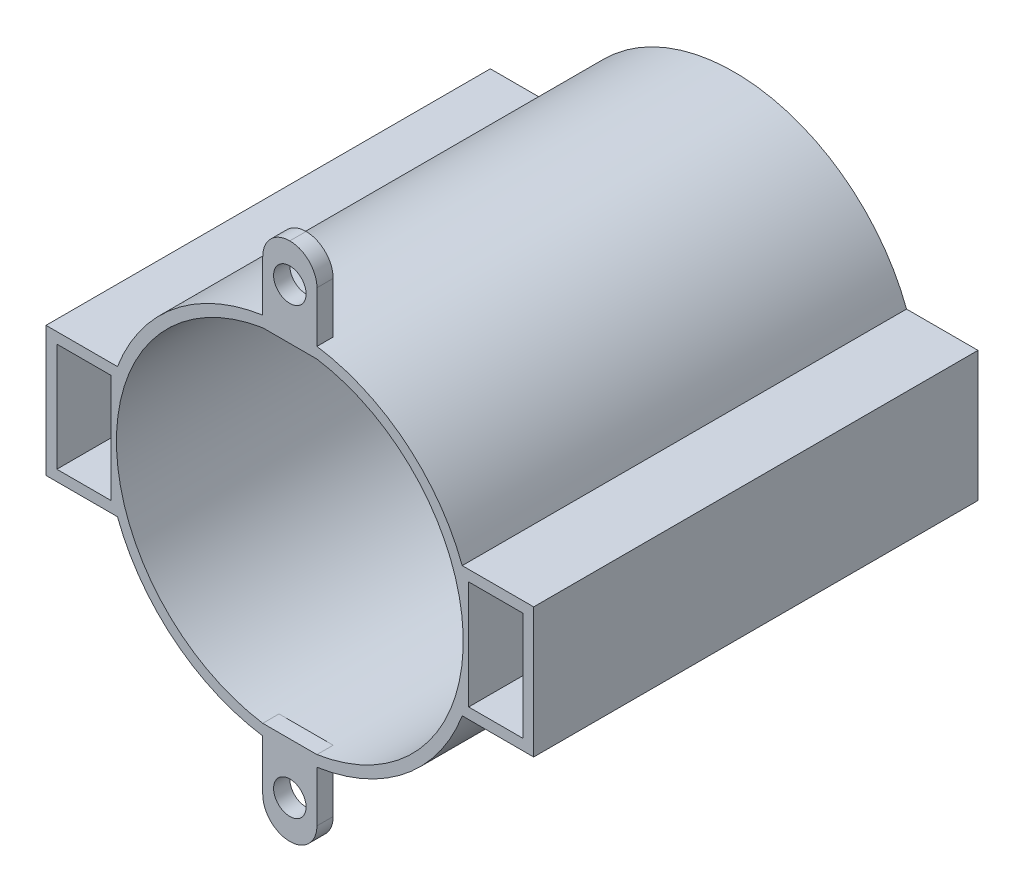
ISO-10303-21;
HEADER;
FILE_DESCRIPTION(('STEP AP214'),'2;1');
FILE_NAME('part.step','',(''),(''),'','','');
FILE_SCHEMA(('AUTOMOTIVE_DESIGN { 1 0 10303 214 1 1 1 1 }'));
ENDSEC;
DATA;
#1=APPLICATION_CONTEXT('core data for automotive mechanical design processes');
#2=APPLICATION_PROTOCOL_DEFINITION('international standard','automotive_design',2000,#1);
#3=PRODUCT_CONTEXT('',#1,'mechanical');
#4=PRODUCT('Part','Part','',(#3));
#5=PRODUCT_RELATED_PRODUCT_CATEGORY('part','',(#4));
#6=PRODUCT_DEFINITION_FORMATION('','',#4);
#7=PRODUCT_DEFINITION_CONTEXT('part definition',#1,'design');
#8=PRODUCT_DEFINITION('design','',#6,#7);
#9=PRODUCT_DEFINITION_SHAPE('','',#8);
#10=(LENGTH_UNIT() NAMED_UNIT(*) SI_UNIT(.MILLI.,.METRE.));
#11=(NAMED_UNIT(*) PLANE_ANGLE_UNIT() SI_UNIT($,.RADIAN.));
#12=(NAMED_UNIT(*) SI_UNIT($,.STERADIAN.) SOLID_ANGLE_UNIT());
#13=UNCERTAINTY_MEASURE_WITH_UNIT(LENGTH_MEASURE(1.E-05),#10,'distance_accuracy_value','');
#14=(GEOMETRIC_REPRESENTATION_CONTEXT(3) GLOBAL_UNCERTAINTY_ASSIGNED_CONTEXT((#13)) GLOBAL_UNIT_ASSIGNED_CONTEXT((#10,
#11,#12)) REPRESENTATION_CONTEXT('',''));
#15=CARTESIAN_POINT('',(0.,0.,0.));
#16=DIRECTION('',(0.,0.,1.));
#17=DIRECTION('',(1.,0.,0.));
#18=AXIS2_PLACEMENT_3D('',#15,#16,#17);
#19=CARTESIAN_POINT('',(0.,0.,-14.));
#20=DIRECTION('',(0.,0.,1.));
#21=DIRECTION('',(1.,0.,0.));
#22=AXIS2_PLACEMENT_3D('',#19,#20,#21);
#23=CYLINDRICAL_SURFACE('',#22,5.15);
#24=CARTESIAN_POINT('',(0.,0.,-14.));
#25=DIRECTION('',(0.,0.,1.));
#26=DIRECTION('',(1.,0.,0.));
#27=AXIS2_PLACEMENT_3D('',#24,#25,#26);
#28=CIRCLE('',#27,5.15);
#29=CARTESIAN_POINT('',(5.15,0.,-14.));
#30=VERTEX_POINT('',#29);
#31=EDGE_CURVE('E1034',#30,#30,#28,.T.);
#32=ORIENTED_EDGE('',*,*,#31,.F.);
#33=EDGE_LOOP('',(#32));
#34=FACE_BOUND('',#33,.T.);
#35=CARTESIAN_POINT('',(0.,0.,-9.));
#36=DIRECTION('',(0.,0.,1.));
#37=DIRECTION('',(1.,0.,0.));
#38=AXIS2_PLACEMENT_3D('',#35,#36,#37);
#39=CIRCLE('',#38,5.15);
#40=CARTESIAN_POINT('',(5.15,0.,-9.));
#41=VERTEX_POINT('',#40);
#42=EDGE_CURVE('E13',#41,#41,#39,.F.);
#43=ORIENTED_EDGE('',*,*,#42,.F.);
#44=EDGE_LOOP('',(#43));
#45=FACE_BOUND('',#44,.T.);
#46=ADVANCED_FACE('F789',(#34,#45),#23,.F.);
#47=CARTESIAN_POINT('',(0.,0.,27.));
#48=DIRECTION('',(0.,0.,-1.));
#49=DIRECTION('',(-1.,0.,0.));
#50=AXIS2_PLACEMENT_3D('',#47,#48,#49);
#51=CYLINDRICAL_SURFACE('',#50,16.);
#52=CARTESIAN_POINT('',(0.,0.,0.));
#53=DIRECTION('',(0.,0.,1.));
#54=DIRECTION('',(1.,0.,0.));
#55=AXIS2_PLACEMENT_3D('',#52,#53,#54);
#56=CIRCLE('',#55,16.);
#57=CARTESIAN_POINT('',(16.,0.,0.));
#58=VERTEX_POINT('',#57);
#59=EDGE_CURVE('E1085',#58,#58,#56,.T.);
#60=ORIENTED_EDGE('',*,*,#59,.F.);
#61=EDGE_LOOP('',(#60));
#62=FACE_BOUND('',#61,.T.);
#63=CARTESIAN_POINT('',(0.,0.,25.5));
#64=DIRECTION('',(0.,0.,1.));
#65=DIRECTION('',(1.,0.,0.));
#66=AXIS2_PLACEMENT_3D('',#63,#64,#65);
#67=CIRCLE('',#66,16.);
#68=CARTESIAN_POINT('',(-2.5,-15.8034806292791,25.5));
#69=VERTEX_POINT('',#68);
#70=CARTESIAN_POINT('',(2.5,-15.8034806292791,25.5));
#71=VERTEX_POINT('',#70);
#72=EDGE_CURVE('E1126',#69,#71,#67,.T.);
#73=ORIENTED_EDGE('',*,*,#72,.T.);
#74=DIRECTION('',(0.,0.,1.));
#75=VECTOR('',#74,1.);
#76=CARTESIAN_POINT('',(2.5,-15.8034806292791,25.5));
#77=LINE('',#76,#75);
#78=CARTESIAN_POINT('',(2.5,-15.8034806292791,27.));
#79=VERTEX_POINT('',#78);
#80=EDGE_CURVE('E1185',#71,#79,#77,.T.);
#81=ORIENTED_EDGE('',*,*,#80,.T.);
#82=CARTESIAN_POINT('',(0.,0.,27.));
#83=DIRECTION('',(0.,0.,1.));
#84=DIRECTION('',(1.,0.,0.));
#85=AXIS2_PLACEMENT_3D('',#82,#83,#84);
#86=CIRCLE('',#85,16.);
#87=CARTESIAN_POINT('',(2.50000000000001,15.8034806292791,27.));
#88=VERTEX_POINT('',#87);
#89=EDGE_CURVE('E1095',#79,#88,#86,.T.);
#90=ORIENTED_EDGE('',*,*,#89,.T.);
#91=DIRECTION('',(0.,0.,1.));
#92=VECTOR('',#91,1.);
#93=CARTESIAN_POINT('',(2.5,15.8034806292791,25.5));
#94=LINE('',#93,#92);
#95=CARTESIAN_POINT('',(2.5,15.8034806292791,25.5));
#96=VERTEX_POINT('',#95);
#97=EDGE_CURVE('E1206',#96,#88,#94,.T.);
#98=ORIENTED_EDGE('',*,*,#97,.F.);
#99=CARTESIAN_POINT('',(0.,0.,25.5));
#100=DIRECTION('',(0.,0.,1.));
#101=DIRECTION('',(1.,0.,0.));
#102=AXIS2_PLACEMENT_3D('',#99,#100,#101);
#103=CIRCLE('',#102,16.);
#104=CARTESIAN_POINT('',(-2.5,15.8034806292791,25.5));
#105=VERTEX_POINT('',#104);
#106=EDGE_CURVE('E1104',#96,#105,#103,.T.);
#107=ORIENTED_EDGE('',*,*,#106,.T.);
#108=DIRECTION('',(0.,0.,1.));
#109=VECTOR('',#108,1.);
#110=CARTESIAN_POINT('',(-2.5,15.8034806292791,25.5));
#111=LINE('',#110,#109);
#112=CARTESIAN_POINT('',(-2.5,15.8034806292791,27.));
#113=VERTEX_POINT('',#112);
#114=EDGE_CURVE('E1214',#105,#113,#111,.T.);
#115=ORIENTED_EDGE('',*,*,#114,.T.);
#116=CARTESIAN_POINT('',(-2.5,-15.8034806292791,27.));
#117=VERTEX_POINT('',#116);
#118=EDGE_CURVE('E1092',#113,#117,#86,.T.);
#119=ORIENTED_EDGE('',*,*,#118,.T.);
#120=DIRECTION('',(0.,0.,1.));
#121=VECTOR('',#120,1.);
#122=CARTESIAN_POINT('',(-2.5,-15.8034806292791,25.5));
#123=LINE('',#122,#121);
#124=EDGE_CURVE('E1177',#69,#117,#123,.T.);
#125=ORIENTED_EDGE('',*,*,#124,.F.);
#126=EDGE_LOOP('',(#73,#81,#90,#98,#107,#115,#119,#125));
#127=FACE_BOUND('',#126,.T.);
#128=ADVANCED_FACE('F1261',(#62,#127),#51,.F.);
#129=CARTESIAN_POINT('',(0.,0.,27.));
#130=DIRECTION('',(0.,0.,-1.));
#131=DIRECTION('',(-1.,0.,0.));
#132=AXIS2_PLACEMENT_3D('',#129,#130,#131);
#133=CYLINDRICAL_SURFACE('',#132,17.);
#134=DIRECTION('',(0.,0.,-1.));
#135=VECTOR('',#134,1.);
#136=CARTESIAN_POINT('',(2.5,-16.8151717208002,27.));
#137=LINE('',#136,#135);
#138=CARTESIAN_POINT('',(2.5,-16.8151717208002,25.5));
#139=VERTEX_POINT('',#138);
#140=CARTESIAN_POINT('',(2.5,-16.8151717208002,27.));
#141=VERTEX_POINT('',#140);
#142=EDGE_CURVE('E1131',#139,#141,#137,.F.);
#143=ORIENTED_EDGE('',*,*,#142,.F.);
#144=CARTESIAN_POINT('',(0.,0.,25.5));
#145=DIRECTION('',(0.,0.,1.));
#146=DIRECTION('',(1.,0.,0.));
#147=AXIS2_PLACEMENT_3D('',#144,#145,#146);
#148=CIRCLE('',#147,17.);
#149=CARTESIAN_POINT('',(-2.5,-16.8151717208002,25.5));
#150=VERTEX_POINT('',#149);
#151=EDGE_CURVE('E1129',#150,#139,#148,.T.);
#152=ORIENTED_EDGE('',*,*,#151,.F.);
#153=DIRECTION('',(0.,0.,-1.));
#154=VECTOR('',#153,1.);
#155=CARTESIAN_POINT('',(-2.5,-16.8151717208002,27.));
#156=LINE('',#155,#154);
#157=CARTESIAN_POINT('',(-2.5,-16.8151717208002,27.));
#158=VERTEX_POINT('',#157);
#159=EDGE_CURVE('E1121',#150,#158,#156,.F.);
#160=ORIENTED_EDGE('',*,*,#159,.T.);
#161=CARTESIAN_POINT('',(0.,0.,27.));
#162=DIRECTION('',(0.,0.,1.));
#163=DIRECTION('',(1.,0.,0.));
#164=AXIS2_PLACEMENT_3D('',#161,#162,#163);
#165=CIRCLE('',#164,17.);
#166=CARTESIAN_POINT('',(-15.9059737205869,-6.00000000000001,27.));
#167=VERTEX_POINT('',#166);
#168=EDGE_CURVE('E1106',#167,#158,#165,.T.);
#169=ORIENTED_EDGE('',*,*,#168,.F.);
#170=DIRECTION('',(0.,0.,1.));
#171=VECTOR('',#170,1.);
#172=CARTESIAN_POINT('',(-15.9059737205869,-6.00000000000001,-14.));
#173=LINE('',#172,#171);
#174=CARTESIAN_POINT('',(-15.9059737205869,-6.00000000000001,-14.));
#175=VERTEX_POINT('',#174);
#176=EDGE_CURVE('E1022',#175,#167,#173,.T.);
#177=ORIENTED_EDGE('',*,*,#176,.F.);
#178=CARTESIAN_POINT('',(0.,0.,-14.));
#179=DIRECTION('',(0.,0.,1.));
#180=DIRECTION('',(1.,0.,0.));
#181=AXIS2_PLACEMENT_3D('',#178,#179,#180);
#182=CIRCLE('',#181,17.);
#183=CARTESIAN_POINT('',(15.9059737205869,-6.00000000000001,-14.));
#184=VERTEX_POINT('',#183);
#185=EDGE_CURVE('E1094',#175,#184,#182,.T.);
#186=ORIENTED_EDGE('',*,*,#185,.T.);
#187=DIRECTION('',(0.,0.,1.));
#188=VECTOR('',#187,1.);
#189=CARTESIAN_POINT('',(15.9059737205869,-6.00000000000001,-14.));
#190=LINE('',#189,#188);
#191=CARTESIAN_POINT('',(15.9059737205869,-6.00000000000001,27.));
#192=VERTEX_POINT('',#191);
#193=EDGE_CURVE('E1082',#184,#192,#190,.T.);
#194=ORIENTED_EDGE('',*,*,#193,.T.);
#195=EDGE_CURVE('E1100',#141,#192,#165,.T.);
#196=ORIENTED_EDGE('',*,*,#195,.F.);
#197=EDGE_LOOP('',(#143,#152,#160,#169,#177,#186,#194,#196));
#198=FACE_BOUND('',#197,.T.);
#199=ADVANCED_FACE('F1255',(#198),#133,.T.);
#200=DIRECTION('',(0.,0.,-1.));
#201=VECTOR('',#200,1.);
#202=CARTESIAN_POINT('',(-2.5,16.8151717208002,27.));
#203=LINE('',#202,#201);
#204=CARTESIAN_POINT('',(-2.5,16.8151717208002,25.5));
#205=VERTEX_POINT('',#204);
#206=CARTESIAN_POINT('',(-2.5,16.8151717208002,27.));
#207=VERTEX_POINT('',#206);
#208=EDGE_CURVE('E1224',#205,#207,#203,.F.);
#209=ORIENTED_EDGE('',*,*,#208,.F.);
#210=CARTESIAN_POINT('',(0.,0.,25.5));
#211=DIRECTION('',(0.,0.,1.));
#212=DIRECTION('',(1.,0.,0.));
#213=AXIS2_PLACEMENT_3D('',#210,#211,#212);
#214=CIRCLE('',#213,17.);
#215=CARTESIAN_POINT('',(2.5,16.8151717208002,25.5));
#216=VERTEX_POINT('',#215);
#217=EDGE_CURVE('E1217',#216,#205,#214,.T.);
#218=ORIENTED_EDGE('',*,*,#217,.F.);
#219=DIRECTION('',(0.,0.,-1.));
#220=VECTOR('',#219,1.);
#221=CARTESIAN_POINT('',(2.5,16.8151717208002,27.));
#222=LINE('',#221,#220);
#223=CARTESIAN_POINT('',(2.5,16.8151717208002,27.));
#224=VERTEX_POINT('',#223);
#225=EDGE_CURVE('E1221',#216,#224,#222,.F.);
#226=ORIENTED_EDGE('',*,*,#225,.T.);
#227=CARTESIAN_POINT('',(15.9059737205869,6.00000000000001,27.));
#228=VERTEX_POINT('',#227);
#229=EDGE_CURVE('E1101',#228,#224,#165,.T.);
#230=ORIENTED_EDGE('',*,*,#229,.F.);
#231=DIRECTION('',(0.,0.,1.));
#232=VECTOR('',#231,1.);
#233=CARTESIAN_POINT('',(15.9059737205869,6.00000000000001,-14.));
#234=LINE('',#233,#232);
#235=CARTESIAN_POINT('',(15.9059737205869,6.00000000000001,-14.));
#236=VERTEX_POINT('',#235);
#237=EDGE_CURVE('E1086',#236,#228,#234,.T.);
#238=ORIENTED_EDGE('',*,*,#237,.F.);
#239=CARTESIAN_POINT('',(-15.9059737205869,6.00000000000001,-14.));
#240=VERTEX_POINT('',#239);
#241=EDGE_CURVE('E1098',#236,#240,#182,.T.);
#242=ORIENTED_EDGE('',*,*,#241,.T.);
#243=DIRECTION('',(0.,0.,1.));
#244=VECTOR('',#243,1.);
#245=CARTESIAN_POINT('',(-15.9059737205869,6.00000000000001,-14.));
#246=LINE('',#245,#244);
#247=CARTESIAN_POINT('',(-15.9059737205869,6.00000000000001,27.));
#248=VERTEX_POINT('',#247);
#249=EDGE_CURVE('E1037',#240,#248,#246,.T.);
#250=ORIENTED_EDGE('',*,*,#249,.T.);
#251=EDGE_CURVE('E1105',#207,#248,#165,.T.);
#252=ORIENTED_EDGE('',*,*,#251,.F.);
#253=EDGE_LOOP('',(#209,#218,#226,#230,#238,#242,#250,#252));
#254=FACE_BOUND('',#253,.T.);
#255=ADVANCED_FACE('F1245',(#254),#133,.T.);
#256=CARTESIAN_POINT('',(0.,0.,27.));
#257=DIRECTION('',(0.,0.,1.));
#258=DIRECTION('',(1.,0.,0.));
#259=AXIS2_PLACEMENT_3D('',#256,#257,#258);
#260=PLANE('',#259);
#261=DIRECTION('',(0.,-1.,0.));
#262=VECTOR('',#261,1.);
#263=CARTESIAN_POINT('',(-2.5,-15.8034806292791,27.));
#264=LINE('',#263,#262);
#265=CARTESIAN_POINT('',(-2.5,-21.5,27.));
#266=VERTEX_POINT('',#265);
#267=EDGE_CURVE('E1180',#158,#266,#264,.T.);
#268=ORIENTED_EDGE('',*,*,#267,.T.);
#269=CARTESIAN_POINT('',(0.,-21.5,27.));
#270=DIRECTION('',(0.,0.,1.));
#271=DIRECTION('',(1.,0.,0.));
#272=AXIS2_PLACEMENT_3D('',#269,#270,#271);
#273=CIRCLE('',#272,2.5);
#274=CARTESIAN_POINT('',(0.,-24.,27.));
#275=VERTEX_POINT('',#274);
#276=EDGE_CURVE('E1138',#266,#275,#273,.T.);
#277=ORIENTED_EDGE('',*,*,#276,.T.);
#278=CARTESIAN_POINT('',(0.,-21.5,27.));
#279=DIRECTION('',(0.,0.,1.));
#280=DIRECTION('',(1.,0.,0.));
#281=AXIS2_PLACEMENT_3D('',#278,#279,#280);
#282=CIRCLE('',#281,2.5);
#283=CARTESIAN_POINT('',(2.5,-21.5,27.));
#284=VERTEX_POINT('',#283);
#285=EDGE_CURVE('E1136',#275,#284,#282,.T.);
#286=ORIENTED_EDGE('',*,*,#285,.T.);
#287=DIRECTION('',(0.,-1.,0.));
#288=VECTOR('',#287,1.);
#289=CARTESIAN_POINT('',(2.5,-15.8034806292791,27.));
#290=LINE('',#289,#288);
#291=EDGE_CURVE('E1171',#141,#284,#290,.T.);
#292=ORIENTED_EDGE('',*,*,#291,.F.);
#293=ORIENTED_EDGE('',*,*,#195,.T.);
#294=DIRECTION('',(1.,0.,0.));
#295=VECTOR('',#294,1.);
#296=CARTESIAN_POINT('',(0.,-6.00000000000001,27.));
#297=LINE('',#296,#295);
#298=CARTESIAN_POINT('',(22.5,-6.00000000000001,27.));
#299=VERTEX_POINT('',#298);
#300=EDGE_CURVE('E1059',#192,#299,#297,.T.);
#301=ORIENTED_EDGE('',*,*,#300,.T.);
#302=DIRECTION('',(0.,1.,0.));
#303=VECTOR('',#302,1.);
#304=CARTESIAN_POINT('',(22.5,0.,27.));
#305=LINE('',#304,#303);
#306=CARTESIAN_POINT('',(22.5,6.00000000000001,27.));
#307=VERTEX_POINT('',#306);
#308=EDGE_CURVE('E1077',#299,#307,#305,.T.);
#309=ORIENTED_EDGE('',*,*,#308,.T.);
#310=DIRECTION('',(1.,0.,0.));
#311=VECTOR('',#310,1.);
#312=CARTESIAN_POINT('',(0.,6.00000000000001,27.));
#313=LINE('',#312,#311);
#314=EDGE_CURVE('E1069',#228,#307,#313,.T.);
#315=ORIENTED_EDGE('',*,*,#314,.F.);
#316=ORIENTED_EDGE('',*,*,#229,.T.);
#317=DIRECTION('',(0.,1.,0.));
#318=VECTOR('',#317,1.);
#319=CARTESIAN_POINT('',(2.5,15.8034806292791,27.));
#320=LINE('',#319,#318);
#321=CARTESIAN_POINT('',(2.5,21.5,27.));
#322=VERTEX_POINT('',#321);
#323=EDGE_CURVE('E1209',#224,#322,#320,.T.);
#324=ORIENTED_EDGE('',*,*,#323,.T.);
#325=CARTESIAN_POINT('',(0.,21.5,27.));
#326=DIRECTION('',(0.,0.,1.));
#327=DIRECTION('',(1.,0.,0.));
#328=AXIS2_PLACEMENT_3D('',#325,#326,#327);
#329=CIRCLE('',#328,2.5);
#330=CARTESIAN_POINT('',(0.,24.,27.));
#331=VERTEX_POINT('',#330);
#332=EDGE_CURVE('E1108',#322,#331,#329,.T.);
#333=ORIENTED_EDGE('',*,*,#332,.T.);
#334=CARTESIAN_POINT('',(0.,21.5,27.));
#335=DIRECTION('',(0.,0.,1.));
#336=DIRECTION('',(1.,0.,0.));
#337=AXIS2_PLACEMENT_3D('',#334,#335,#336);
#338=CIRCLE('',#337,2.5);
#339=CARTESIAN_POINT('',(-2.5,21.5,27.));
#340=VERTEX_POINT('',#339);
#341=EDGE_CURVE('E1110',#331,#340,#338,.T.);
#342=ORIENTED_EDGE('',*,*,#341,.T.);
#343=DIRECTION('',(0.,1.,0.));
#344=VECTOR('',#343,1.);
#345=CARTESIAN_POINT('',(-2.5,15.8034806292791,27.));
#346=LINE('',#345,#344);
#347=EDGE_CURVE('E1200',#207,#340,#346,.T.);
#348=ORIENTED_EDGE('',*,*,#347,.F.);
#349=ORIENTED_EDGE('',*,*,#251,.T.);
#350=DIRECTION('',(-1.,0.,0.));
#351=VECTOR('',#350,1.);
#352=CARTESIAN_POINT('',(0.,6.00000000000001,27.));
#353=LINE('',#352,#351);
#354=CARTESIAN_POINT('',(-22.5,6.00000000000001,27.));
#355=VERTEX_POINT('',#354);
#356=EDGE_CURVE('E1026',#248,#355,#353,.T.);
#357=ORIENTED_EDGE('',*,*,#356,.T.);
#358=DIRECTION('',(0.,1.,0.));
#359=VECTOR('',#358,1.);
#360=CARTESIAN_POINT('',(-22.5,0.,27.));
#361=LINE('',#360,#359);
#362=CARTESIAN_POINT('',(-22.5,-6.00000000000001,27.));
#363=VERTEX_POINT('',#362);
#364=EDGE_CURVE('E1017',#363,#355,#361,.T.);
#365=ORIENTED_EDGE('',*,*,#364,.F.);
#366=DIRECTION('',(-1.,0.,0.));
#367=VECTOR('',#366,1.);
#368=CARTESIAN_POINT('',(0.,-6.00000000000001,27.));
#369=LINE('',#368,#367);
#370=EDGE_CURVE('E1023',#167,#363,#369,.T.);
#371=ORIENTED_EDGE('',*,*,#370,.F.);
#372=ORIENTED_EDGE('',*,*,#168,.T.);
#373=EDGE_LOOP('',(#268,#277,#286,#292,#293,#301,#309,#315,#316,#324,#333,#342,#348,#349,#357,
#365,#371,#372));
#374=FACE_BOUND('',#373,.T.);
#375=ORIENTED_EDGE('',*,*,#89,.F.);
#376=DIRECTION('',(1.,0.,0.));
#377=VECTOR('',#376,1.);
#378=CARTESIAN_POINT('',(-2.5,-15.8034806292791,27.));
#379=LINE('',#378,#377);
#380=EDGE_CURVE('E1165',#117,#79,#379,.T.);
#381=ORIENTED_EDGE('',*,*,#380,.F.);
#382=ORIENTED_EDGE('',*,*,#118,.F.);
#383=DIRECTION('',(1.,0.,0.));
#384=VECTOR('',#383,1.);
#385=CARTESIAN_POINT('',(-2.5,15.8034806292791,27.));
#386=LINE('',#385,#384);
#387=EDGE_CURVE('E1193',#113,#88,#386,.T.);
#388=ORIENTED_EDGE('',*,*,#387,.T.);
#389=EDGE_LOOP('',(#375,#381,#382,#388));
#390=FACE_BOUND('',#389,.T.);
#391=CARTESIAN_POINT('',(0.,-20.5,27.));
#392=DIRECTION('',(0.,0.,-1.));
#393=DIRECTION('',(1.,0.,0.));
#394=AXIS2_PLACEMENT_3D('',#391,#392,#393);
#395=CIRCLE('',#394,1.5);
#396=CARTESIAN_POINT('',(1.5,-20.5,27.));
#397=VERTEX_POINT('',#396);
#398=EDGE_CURVE('E1146',#397,#397,#395,.T.);
#399=ORIENTED_EDGE('',*,*,#398,.T.);
#400=EDGE_LOOP('',(#399));
#401=FACE_BOUND('',#400,.T.);
#402=CARTESIAN_POINT('',(0.,20.5,27.));
#403=DIRECTION('',(0.,0.,1.));
#404=DIRECTION('',(1.,0.,0.));
#405=AXIS2_PLACEMENT_3D('',#402,#403,#404);
#406=CIRCLE('',#405,1.5);
#407=CARTESIAN_POINT('',(1.5,20.5,27.));
#408=VERTEX_POINT('',#407);
#409=EDGE_CURVE('E1125',#408,#408,#406,.T.);
#410=ORIENTED_EDGE('',*,*,#409,.F.);
#411=EDGE_LOOP('',(#410));
#412=FACE_BOUND('',#411,.T.);
#413=DIRECTION('',(-1.,0.,0.));
#414=VECTOR('',#413,1.);
#415=CARTESIAN_POINT('',(0.,4.99999999999999,27.));
#416=LINE('',#415,#414);
#417=CARTESIAN_POINT('',(21.5,5.,27.));
#418=VERTEX_POINT('',#417);
#419=CARTESIAN_POINT('',(16.5,5.,27.));
#420=VERTEX_POINT('',#419);
#421=EDGE_CURVE('E1044',#418,#420,#416,.T.);
#422=ORIENTED_EDGE('',*,*,#421,.F.);
#423=DIRECTION('',(0.,-1.,0.));
#424=VECTOR('',#423,1.);
#425=CARTESIAN_POINT('',(21.5,0.,27.));
#426=LINE('',#425,#424);
#427=CARTESIAN_POINT('',(21.5,-5.,27.));
#428=VERTEX_POINT('',#427);
#429=EDGE_CURVE('E1053',#418,#428,#426,.T.);
#430=ORIENTED_EDGE('',*,*,#429,.T.);
#431=DIRECTION('',(-1.,0.,0.));
#432=VECTOR('',#431,1.);
#433=CARTESIAN_POINT('',(0.,-5.,27.));
#434=LINE('',#433,#432);
#435=CARTESIAN_POINT('',(16.5,-5.,27.));
#436=VERTEX_POINT('',#435);
#437=EDGE_CURVE('E1050',#428,#436,#434,.T.);
#438=ORIENTED_EDGE('',*,*,#437,.T.);
#439=DIRECTION('',(0.,-1.,0.));
#440=VECTOR('',#439,1.);
#441=CARTESIAN_POINT('',(16.5,0.,27.));
#442=LINE('',#441,#440);
#443=EDGE_CURVE('E1047',#420,#436,#442,.T.);
#444=ORIENTED_EDGE('',*,*,#443,.F.);
#445=EDGE_LOOP('',(#422,#430,#438,#444));
#446=FACE_BOUND('',#445,.T.);
#447=DIRECTION('',(0.,-1.,0.));
#448=VECTOR('',#447,1.);
#449=CARTESIAN_POINT('',(-21.5,0.,27.));
#450=LINE('',#449,#448);
#451=CARTESIAN_POINT('',(-21.5,5.,27.));
#452=VERTEX_POINT('',#451);
#453=CARTESIAN_POINT('',(-21.5,-5.,27.));
#454=VERTEX_POINT('',#453);
#455=EDGE_CURVE('E1003',#452,#454,#450,.T.);
#456=ORIENTED_EDGE('',*,*,#455,.F.);
#457=DIRECTION('',(1.,0.,0.));
#458=VECTOR('',#457,1.);
#459=CARTESIAN_POINT('',(0.,4.99999999999999,27.));
#460=LINE('',#459,#458);
#461=CARTESIAN_POINT('',(-16.5,5.,27.));
#462=VERTEX_POINT('',#461);
#463=EDGE_CURVE('E1227',#452,#462,#460,.T.);
#464=ORIENTED_EDGE('',*,*,#463,.T.);
#465=DIRECTION('',(0.,-1.,0.));
#466=VECTOR('',#465,1.);
#467=CARTESIAN_POINT('',(-16.5,0.,27.));
#468=LINE('',#467,#466);
#469=CARTESIAN_POINT('',(-16.5,-5.,27.));
#470=VERTEX_POINT('',#469);
#471=EDGE_CURVE('E1009',#462,#470,#468,.T.);
#472=ORIENTED_EDGE('',*,*,#471,.T.);
#473=DIRECTION('',(1.,0.,0.));
#474=VECTOR('',#473,1.);
#475=CARTESIAN_POINT('',(0.,-5.,27.));
#476=LINE('',#475,#474);
#477=EDGE_CURVE('E1231',#454,#470,#476,.T.);
#478=ORIENTED_EDGE('',*,*,#477,.F.);
#479=EDGE_LOOP('',(#456,#464,#472,#478));
#480=FACE_BOUND('',#479,.T.);
#481=ADVANCED_FACE('F1242',(#374,#390,#401,#412,#446,#480),#260,.T.);
#482=CARTESIAN_POINT('',(0.,0.,-14.));
#483=DIRECTION('',(0.,0.,1.));
#484=DIRECTION('',(1.,0.,0.));
#485=AXIS2_PLACEMENT_3D('',#482,#483,#484);
#486=PLANE('',#485);
#487=ORIENTED_EDGE('',*,*,#241,.F.);
#488=DIRECTION('',(1.,0.,0.));
#489=VECTOR('',#488,1.);
#490=CARTESIAN_POINT('',(0.,6.00000000000001,-14.));
#491=LINE('',#490,#489);
#492=CARTESIAN_POINT('',(22.5,6.00000000000001,-14.));
#493=VERTEX_POINT('',#492);
#494=EDGE_CURVE('E1072',#236,#493,#491,.T.);
#495=ORIENTED_EDGE('',*,*,#494,.T.);
#496=DIRECTION('',(0.,1.,0.));
#497=VECTOR('',#496,1.);
#498=CARTESIAN_POINT('',(22.5,0.,-14.));
#499=LINE('',#498,#497);
#500=CARTESIAN_POINT('',(22.5,-6.00000000000001,-14.));
#501=VERTEX_POINT('',#500);
#502=EDGE_CURVE('E1068',#501,#493,#499,.T.);
#503=ORIENTED_EDGE('',*,*,#502,.F.);
#504=DIRECTION('',(1.,0.,0.));
#505=VECTOR('',#504,1.);
#506=CARTESIAN_POINT('',(0.,-6.00000000000001,-14.));
#507=LINE('',#506,#505);
#508=EDGE_CURVE('E1065',#184,#501,#507,.T.);
#509=ORIENTED_EDGE('',*,*,#508,.F.);
#510=ORIENTED_EDGE('',*,*,#185,.F.);
#511=DIRECTION('',(-1.,0.,0.));
#512=VECTOR('',#511,1.);
#513=CARTESIAN_POINT('',(0.,-6.00000000000001,-14.));
#514=LINE('',#513,#512);
#515=CARTESIAN_POINT('',(-22.5,-6.00000000000001,-14.));
#516=VERTEX_POINT('',#515);
#517=EDGE_CURVE('E1013',#175,#516,#514,.T.);
#518=ORIENTED_EDGE('',*,*,#517,.T.);
#519=DIRECTION('',(0.,1.,0.));
#520=VECTOR('',#519,1.);
#521=CARTESIAN_POINT('',(-22.5,0.,-14.));
#522=LINE('',#521,#520);
#523=CARTESIAN_POINT('',(-22.5,6.00000000000001,-14.));
#524=VERTEX_POINT('',#523);
#525=EDGE_CURVE('E1020',#516,#524,#522,.T.);
#526=ORIENTED_EDGE('',*,*,#525,.T.);
#527=DIRECTION('',(-1.,0.,0.));
#528=VECTOR('',#527,1.);
#529=CARTESIAN_POINT('',(0.,6.00000000000001,-14.));
#530=LINE('',#529,#528);
#531=EDGE_CURVE('E1016',#240,#524,#530,.T.);
#532=ORIENTED_EDGE('',*,*,#531,.F.);
#533=EDGE_LOOP('',(#487,#495,#503,#509,#510,#518,#526,#532));
#534=FACE_BOUND('',#533,.T.);
#535=ORIENTED_EDGE('',*,*,#31,.T.);
#536=EDGE_LOOP('',(#535));
#537=FACE_BOUND('',#536,.T.);
#538=ADVANCED_FACE('F1244',(#534,#537),#486,.F.);
#539=CARTESIAN_POINT('',(0.,0.,0.));
#540=DIRECTION('',(0.,0.,1.));
#541=DIRECTION('',(1.,0.,0.));
#542=AXIS2_PLACEMENT_3D('',#539,#540,#541);
#543=PLANE('',#542);
#544=ORIENTED_EDGE('',*,*,#59,.T.);
#545=EDGE_LOOP('',(#544));
#546=FACE_BOUND('',#545,.T.);
#547=CARTESIAN_POINT('',(0.,0.,0.));
#548=DIRECTION('',(0.,0.,1.));
#549=DIRECTION('',(1.,0.,0.));
#550=AXIS2_PLACEMENT_3D('',#547,#548,#549);
#551=CIRCLE('',#550,3.3375);
#552=CARTESIAN_POINT('',(3.3375,0.,0.));
#553=VERTEX_POINT('',#552);
#554=EDGE_CURVE('E1155',#553,#553,#551,.T.);
#555=ORIENTED_EDGE('',*,*,#554,.F.);
#556=EDGE_LOOP('',(#555));
#557=FACE_BOUND('',#556,.T.);
#558=ADVANCED_FACE('F1252',(#546,#557),#543,.T.);
#559=CARTESIAN_POINT('',(0.,-6.00000000000001,-14.));
#560=DIRECTION('',(0.,-1.,0.));
#561=DIRECTION('',(0.,0.,-1.));
#562=AXIS2_PLACEMENT_3D('',#559,#560,#561);
#563=PLANE('',#562);
#564=ORIENTED_EDGE('',*,*,#300,.F.);
#565=ORIENTED_EDGE('',*,*,#193,.F.);
#566=ORIENTED_EDGE('',*,*,#508,.T.);
#567=DIRECTION('',(0.,0.,1.));
#568=VECTOR('',#567,1.);
#569=CARTESIAN_POINT('',(22.5,-6.00000000000001,-14.));
#570=LINE('',#569,#568);
#571=EDGE_CURVE('E1074',#501,#299,#570,.T.);
#572=ORIENTED_EDGE('',*,*,#571,.T.);
#573=EDGE_LOOP('',(#564,#565,#566,#572));
#574=FACE_BOUND('',#573,.T.);
#575=ADVANCED_FACE('F1294',(#574),#563,.T.);
#576=CARTESIAN_POINT('',(0.,6.00000000000001,-14.));
#577=DIRECTION('',(0.,-1.,0.));
#578=DIRECTION('',(0.,0.,-1.));
#579=AXIS2_PLACEMENT_3D('',#576,#577,#578);
#580=PLANE('',#579);
#581=ORIENTED_EDGE('',*,*,#314,.T.);
#582=DIRECTION('',(0.,0.,1.));
#583=VECTOR('',#582,1.);
#584=CARTESIAN_POINT('',(22.5,6.00000000000001,-14.));
#585=LINE('',#584,#583);
#586=EDGE_CURVE('E1089',#493,#307,#585,.T.);
#587=ORIENTED_EDGE('',*,*,#586,.F.);
#588=ORIENTED_EDGE('',*,*,#494,.F.);
#589=ORIENTED_EDGE('',*,*,#237,.T.);
#590=EDGE_LOOP('',(#581,#587,#588,#589));
#591=FACE_BOUND('',#590,.T.);
#592=ADVANCED_FACE('F1291',(#591),#580,.F.);
#593=CARTESIAN_POINT('',(22.5,0.,-14.));
#594=DIRECTION('',(1.,0.,0.));
#595=DIRECTION('',(0.,0.,-1.));
#596=AXIS2_PLACEMENT_3D('',#593,#594,#595);
#597=PLANE('',#596);
#598=ORIENTED_EDGE('',*,*,#308,.F.);
#599=ORIENTED_EDGE('',*,*,#571,.F.);
#600=ORIENTED_EDGE('',*,*,#502,.T.);
#601=ORIENTED_EDGE('',*,*,#586,.T.);
#602=EDGE_LOOP('',(#598,#599,#600,#601));
#603=FACE_BOUND('',#602,.T.);
#604=ADVANCED_FACE('F1289',(#603),#597,.T.);
#605=CARTESIAN_POINT('',(0.,4.99999999999999,-14.));
#606=DIRECTION('',(0.,1.,0.));
#607=DIRECTION('',(-1.,0.,0.));
#608=AXIS2_PLACEMENT_3D('',#605,#606,#607);
#609=PLANE('',#608);
#610=DIRECTION('',(0.,0.,1.));
#611=VECTOR('',#610,1.);
#612=CARTESIAN_POINT('',(16.5,5.,-14.));
#613=LINE('',#612,#611);
#614=CARTESIAN_POINT('',(16.5,5.,0.));
#615=VERTEX_POINT('',#614);
#616=EDGE_CURVE('E1056',#615,#420,#613,.T.);
#617=ORIENTED_EDGE('',*,*,#616,.F.);
#618=DIRECTION('',(1.,0.,0.));
#619=VECTOR('',#618,1.);
#620=CARTESIAN_POINT('',(16.5,5.,0.));
#621=LINE('',#620,#619);
#622=CARTESIAN_POINT('',(21.5,5.,0.));
#623=VERTEX_POINT('',#622);
#624=EDGE_CURVE('E812',#615,#623,#621,.T.);
#625=ORIENTED_EDGE('',*,*,#624,.T.);
#626=DIRECTION('',(0.,0.,1.));
#627=VECTOR('',#626,1.);
#628=CARTESIAN_POINT('',(21.5,5.,-14.));
#629=LINE('',#628,#627);
#630=EDGE_CURVE('E1057',#623,#418,#629,.T.);
#631=ORIENTED_EDGE('',*,*,#630,.T.);
#632=ORIENTED_EDGE('',*,*,#421,.T.);
#633=EDGE_LOOP('',(#617,#625,#631,#632));
#634=FACE_BOUND('',#633,.T.);
#635=ADVANCED_FACE('F1278',(#634),#609,.F.);
#636=CARTESIAN_POINT('',(21.5,0.,-14.));
#637=DIRECTION('',(-1.,0.,0.));
#638=DIRECTION('',(0.,0.,1.));
#639=AXIS2_PLACEMENT_3D('',#636,#637,#638);
#640=PLANE('',#639);
#641=DIRECTION('',(0.,-1.,0.));
#642=VECTOR('',#641,1.);
#643=CARTESIAN_POINT('',(21.5,5.,0.));
#644=LINE('',#643,#642);
#645=CARTESIAN_POINT('',(21.5,-5.,0.));
#646=VERTEX_POINT('',#645);
#647=EDGE_CURVE('E1754',#623,#646,#644,.T.);
#648=ORIENTED_EDGE('',*,*,#647,.T.);
#649=DIRECTION('',(0.,0.,1.));
#650=VECTOR('',#649,1.);
#651=CARTESIAN_POINT('',(21.5,-5.,-14.));
#652=LINE('',#651,#650);
#653=EDGE_CURVE('E1060',#646,#428,#652,.T.);
#654=ORIENTED_EDGE('',*,*,#653,.T.);
#655=ORIENTED_EDGE('',*,*,#429,.F.);
#656=ORIENTED_EDGE('',*,*,#630,.F.);
#657=EDGE_LOOP('',(#648,#654,#655,#656));
#658=FACE_BOUND('',#657,.T.);
#659=ADVANCED_FACE('F1274',(#658),#640,.T.);
#660=CARTESIAN_POINT('',(0.,-5.,-14.));
#661=DIRECTION('',(0.,1.,0.));
#662=DIRECTION('',(0.,0.,1.));
#663=AXIS2_PLACEMENT_3D('',#660,#661,#662);
#664=PLANE('',#663);
#665=DIRECTION('',(-1.,0.,0.));
#666=VECTOR('',#665,1.);
#667=CARTESIAN_POINT('',(16.5,-5.,0.));
#668=LINE('',#667,#666);
#669=CARTESIAN_POINT('',(16.5,-5.,0.));
#670=VERTEX_POINT('',#669);
#671=EDGE_CURVE('E1757',#646,#670,#668,.T.);
#672=ORIENTED_EDGE('',*,*,#671,.T.);
#673=DIRECTION('',(0.,0.,1.));
#674=VECTOR('',#673,1.);
#675=CARTESIAN_POINT('',(16.5,-5.,-14.));
#676=LINE('',#675,#674);
#677=EDGE_CURVE('E1062',#670,#436,#676,.T.);
#678=ORIENTED_EDGE('',*,*,#677,.T.);
#679=ORIENTED_EDGE('',*,*,#437,.F.);
#680=ORIENTED_EDGE('',*,*,#653,.F.);
#681=EDGE_LOOP('',(#672,#678,#679,#680));
#682=FACE_BOUND('',#681,.T.);
#683=ADVANCED_FACE('F1277',(#682),#664,.T.);
#684=CARTESIAN_POINT('',(16.5,0.,-14.));
#685=DIRECTION('',(-1.,0.,0.));
#686=DIRECTION('',(0.,-1.,0.));
#687=AXIS2_PLACEMENT_3D('',#684,#685,#686);
#688=PLANE('',#687);
#689=ORIENTED_EDGE('',*,*,#677,.F.);
#690=DIRECTION('',(0.,1.,0.));
#691=VECTOR('',#690,1.);
#692=CARTESIAN_POINT('',(16.5,5.,0.));
#693=LINE('',#692,#691);
#694=EDGE_CURVE('E1160',#670,#615,#693,.T.);
#695=ORIENTED_EDGE('',*,*,#694,.T.);
#696=ORIENTED_EDGE('',*,*,#616,.T.);
#697=ORIENTED_EDGE('',*,*,#443,.T.);
#698=EDGE_LOOP('',(#689,#695,#696,#697));
#699=FACE_BOUND('',#698,.T.);
#700=ADVANCED_FACE('F1282',(#699),#688,.F.);
#701=CARTESIAN_POINT('',(0.,-6.00000000000001,-14.));
#702=DIRECTION('',(0.,1.,0.));
#703=DIRECTION('',(0.,0.,1.));
#704=AXIS2_PLACEMENT_3D('',#701,#702,#703);
#705=PLANE('',#704);
#706=ORIENTED_EDGE('',*,*,#370,.T.);
#707=DIRECTION('',(0.,0.,1.));
#708=VECTOR('',#707,1.);
#709=CARTESIAN_POINT('',(-22.5,-6.00000000000001,-14.));
#710=LINE('',#709,#708);
#711=EDGE_CURVE('E1031',#516,#363,#710,.T.);
#712=ORIENTED_EDGE('',*,*,#711,.F.);
#713=ORIENTED_EDGE('',*,*,#517,.F.);
#714=ORIENTED_EDGE('',*,*,#176,.T.);
#715=EDGE_LOOP('',(#706,#712,#713,#714));
#716=FACE_BOUND('',#715,.T.);
#717=ADVANCED_FACE('F1272',(#716),#705,.F.);
#718=CARTESIAN_POINT('',(-22.5,0.,-14.));
#719=DIRECTION('',(1.,0.,0.));
#720=DIRECTION('',(0.,0.,-1.));
#721=AXIS2_PLACEMENT_3D('',#718,#719,#720);
#722=PLANE('',#721);
#723=ORIENTED_EDGE('',*,*,#364,.T.);
#724=DIRECTION('',(0.,0.,1.));
#725=VECTOR('',#724,1.);
#726=CARTESIAN_POINT('',(-22.5,6.00000000000001,-14.));
#727=LINE('',#726,#725);
#728=EDGE_CURVE('E1035',#524,#355,#727,.T.);
#729=ORIENTED_EDGE('',*,*,#728,.F.);
#730=ORIENTED_EDGE('',*,*,#525,.F.);
#731=ORIENTED_EDGE('',*,*,#711,.T.);
#732=EDGE_LOOP('',(#723,#729,#730,#731));
#733=FACE_BOUND('',#732,.T.);
#734=ADVANCED_FACE('F1377',(#733),#722,.F.);
#735=CARTESIAN_POINT('',(0.,6.00000000000001,-14.));
#736=DIRECTION('',(0.,1.,0.));
#737=DIRECTION('',(0.,0.,1.));
#738=AXIS2_PLACEMENT_3D('',#735,#736,#737);
#739=PLANE('',#738);
#740=ORIENTED_EDGE('',*,*,#356,.F.);
#741=ORIENTED_EDGE('',*,*,#249,.F.);
#742=ORIENTED_EDGE('',*,*,#531,.T.);
#743=ORIENTED_EDGE('',*,*,#728,.T.);
#744=EDGE_LOOP('',(#740,#741,#742,#743));
#745=FACE_BOUND('',#744,.T.);
#746=ADVANCED_FACE('F1376',(#745),#739,.T.);
#747=CARTESIAN_POINT('',(0.,4.99999999999999,-14.));
#748=DIRECTION('',(0.,-1.,0.));
#749=DIRECTION('',(1.,0.,0.));
#750=AXIS2_PLACEMENT_3D('',#747,#748,#749);
#751=PLANE('',#750);
#752=DIRECTION('',(-1.,0.,0.));
#753=VECTOR('',#752,1.);
#754=CARTESIAN_POINT('',(-16.5,5.,0.));
#755=LINE('',#754,#753);
#756=CARTESIAN_POINT('',(-16.5,5.,0.));
#757=VERTEX_POINT('',#756);
#758=CARTESIAN_POINT('',(-21.5,5.,0.));
#759=VERTEX_POINT('',#758);
#760=EDGE_CURVE('E804',#757,#759,#755,.T.);
#761=ORIENTED_EDGE('',*,*,#760,.F.);
#762=DIRECTION('',(0.,0.,1.));
#763=VECTOR('',#762,1.);
#764=CARTESIAN_POINT('',(-16.5,5.,-14.));
#765=LINE('',#764,#763);
#766=EDGE_CURVE('E1007',#757,#462,#765,.T.);
#767=ORIENTED_EDGE('',*,*,#766,.T.);
#768=ORIENTED_EDGE('',*,*,#463,.F.);
#769=DIRECTION('',(0.,0.,1.));
#770=VECTOR('',#769,1.);
#771=CARTESIAN_POINT('',(-21.5,5.,-14.));
#772=LINE('',#771,#770);
#773=EDGE_CURVE('E1005',#759,#452,#772,.T.);
#774=ORIENTED_EDGE('',*,*,#773,.F.);
#775=EDGE_LOOP('',(#761,#767,#768,#774));
#776=FACE_BOUND('',#775,.T.);
#777=ADVANCED_FACE('F1238',(#776),#751,.T.);
#778=CARTESIAN_POINT('',(-16.5,0.,-14.));
#779=DIRECTION('',(-1.,0.,0.));
#780=DIRECTION('',(0.,-1.,0.));
#781=AXIS2_PLACEMENT_3D('',#778,#779,#780);
#782=PLANE('',#781);
#783=DIRECTION('',(0.,1.,0.));
#784=VECTOR('',#783,1.);
#785=CARTESIAN_POINT('',(-16.5,5.,0.));
#786=LINE('',#785,#784);
#787=CARTESIAN_POINT('',(-16.5,-5.,0.));
#788=VERTEX_POINT('',#787);
#789=EDGE_CURVE('E999',#788,#757,#786,.T.);
#790=ORIENTED_EDGE('',*,*,#789,.F.);
#791=DIRECTION('',(0.,0.,1.));
#792=VECTOR('',#791,1.);
#793=CARTESIAN_POINT('',(-16.5,-5.,-14.));
#794=LINE('',#793,#792);
#795=EDGE_CURVE('E998',#788,#470,#794,.T.);
#796=ORIENTED_EDGE('',*,*,#795,.T.);
#797=ORIENTED_EDGE('',*,*,#471,.F.);
#798=ORIENTED_EDGE('',*,*,#766,.F.);
#799=EDGE_LOOP('',(#790,#796,#797,#798));
#800=FACE_BOUND('',#799,.T.);
#801=ADVANCED_FACE('F1240',(#800),#782,.T.);
#802=CARTESIAN_POINT('',(0.,-5.,-14.));
#803=DIRECTION('',(0.,-1.,0.));
#804=DIRECTION('',(0.,0.,-1.));
#805=AXIS2_PLACEMENT_3D('',#802,#803,#804);
#806=PLANE('',#805);
#807=ORIENTED_EDGE('',*,*,#795,.F.);
#808=DIRECTION('',(1.,0.,0.));
#809=VECTOR('',#808,1.);
#810=CARTESIAN_POINT('',(-16.5,-5.,0.));
#811=LINE('',#810,#809);
#812=CARTESIAN_POINT('',(-21.5,-5.,0.));
#813=VERTEX_POINT('',#812);
#814=EDGE_CURVE('E986',#813,#788,#811,.T.);
#815=ORIENTED_EDGE('',*,*,#814,.F.);
#816=DIRECTION('',(0.,0.,1.));
#817=VECTOR('',#816,1.);
#818=CARTESIAN_POINT('',(-21.5,-5.,-14.));
#819=LINE('',#818,#817);
#820=EDGE_CURVE('E996',#813,#454,#819,.T.);
#821=ORIENTED_EDGE('',*,*,#820,.T.);
#822=ORIENTED_EDGE('',*,*,#477,.T.);
#823=EDGE_LOOP('',(#807,#815,#821,#822));
#824=FACE_BOUND('',#823,.T.);
#825=ADVANCED_FACE('F994',(#824),#806,.F.);
#826=CARTESIAN_POINT('',(-21.5,0.,-14.));
#827=DIRECTION('',(-1.,0.,0.));
#828=DIRECTION('',(0.,0.,1.));
#829=AXIS2_PLACEMENT_3D('',#826,#827,#828);
#830=PLANE('',#829);
#831=ORIENTED_EDGE('',*,*,#820,.F.);
#832=DIRECTION('',(0.,-1.,0.));
#833=VECTOR('',#832,1.);
#834=CARTESIAN_POINT('',(-21.5,5.,0.));
#835=LINE('',#834,#833);
#836=EDGE_CURVE('E983',#759,#813,#835,.T.);
#837=ORIENTED_EDGE('',*,*,#836,.F.);
#838=ORIENTED_EDGE('',*,*,#773,.T.);
#839=ORIENTED_EDGE('',*,*,#455,.T.);
#840=EDGE_LOOP('',(#831,#837,#838,#839));
#841=FACE_BOUND('',#840,.T.);
#842=ADVANCED_FACE('F1001',(#841),#830,.F.);
#843=CARTESIAN_POINT('',(0.,0.,25.5));
#844=DIRECTION('',(0.,0.,1.));
#845=DIRECTION('',(1.,0.,0.));
#846=AXIS2_PLACEMENT_3D('',#843,#844,#845);
#847=PLANE('',#846);
#848=ORIENTED_EDGE('',*,*,#106,.F.);
#849=DIRECTION('',(1.,0.,0.));
#850=VECTOR('',#849,1.);
#851=CARTESIAN_POINT('',(-2.5,15.8034806292791,25.5));
#852=LINE('',#851,#850);
#853=EDGE_CURVE('E1196',#105,#96,#852,.T.);
#854=ORIENTED_EDGE('',*,*,#853,.F.);
#855=EDGE_LOOP('',(#848,#854));
#856=FACE_BOUND('',#855,.T.);
#857=ADVANCED_FACE('F1356',(#856),#847,.F.);
#858=CARTESIAN_POINT('',(-2.5,15.8034806292791,25.5));
#859=DIRECTION('',(0.,-1.,0.));
#860=DIRECTION('',(0.,0.,-1.));
#861=AXIS2_PLACEMENT_3D('',#858,#859,#860);
#862=PLANE('',#861);
#863=ORIENTED_EDGE('',*,*,#387,.F.);
#864=ORIENTED_EDGE('',*,*,#114,.F.);
#865=ORIENTED_EDGE('',*,*,#853,.T.);
#866=ORIENTED_EDGE('',*,*,#97,.T.);
#867=EDGE_LOOP('',(#863,#864,#865,#866));
#868=FACE_BOUND('',#867,.T.);
#869=ADVANCED_FACE('F1360',(#868),#862,.T.);
#870=CARTESIAN_POINT('',(-2.5,15.8034806292791,25.5));
#871=DIRECTION('',(1.,0.,0.));
#872=DIRECTION('',(0.,0.,-1.));
#873=AXIS2_PLACEMENT_3D('',#870,#871,#872);
#874=PLANE('',#873);
#875=ORIENTED_EDGE('',*,*,#347,.T.);
#876=DIRECTION('',(0.,0.,1.));
#877=VECTOR('',#876,1.);
#878=CARTESIAN_POINT('',(-2.5,21.5,25.5));
#879=LINE('',#878,#877);
#880=CARTESIAN_POINT('',(-2.5,21.5,25.5));
#881=VERTEX_POINT('',#880);
#882=EDGE_CURVE('E1112',#340,#881,#879,.F.);
#883=ORIENTED_EDGE('',*,*,#882,.T.);
#884=DIRECTION('',(0.,1.,0.));
#885=VECTOR('',#884,1.);
#886=CARTESIAN_POINT('',(-2.5,15.8034806292791,25.5));
#887=LINE('',#886,#885);
#888=EDGE_CURVE('E1203',#205,#881,#887,.T.);
#889=ORIENTED_EDGE('',*,*,#888,.F.);
#890=ORIENTED_EDGE('',*,*,#208,.T.);
#891=EDGE_LOOP('',(#875,#883,#889,#890));
#892=FACE_BOUND('',#891,.T.);
#893=ADVANCED_FACE('F1357',(#892),#874,.F.);
#894=CARTESIAN_POINT('',(2.5,15.8034806292791,25.5));
#895=DIRECTION('',(1.,0.,0.));
#896=DIRECTION('',(0.,0.,-1.));
#897=AXIS2_PLACEMENT_3D('',#894,#895,#896);
#898=PLANE('',#897);
#899=DIRECTION('',(0.,1.,0.));
#900=VECTOR('',#899,1.);
#901=CARTESIAN_POINT('',(2.5,15.8034806292791,25.5));
#902=LINE('',#901,#900);
#903=CARTESIAN_POINT('',(2.5,21.5,25.5));
#904=VERTEX_POINT('',#903);
#905=EDGE_CURVE('E1199',#216,#904,#902,.T.);
#906=ORIENTED_EDGE('',*,*,#905,.T.);
#907=DIRECTION('',(0.,0.,1.));
#908=VECTOR('',#907,1.);
#909=CARTESIAN_POINT('',(2.5,21.5,27.));
#910=LINE('',#909,#908);
#911=EDGE_CURVE('E1119',#904,#322,#910,.T.);
#912=ORIENTED_EDGE('',*,*,#911,.T.);
#913=ORIENTED_EDGE('',*,*,#323,.F.);
#914=ORIENTED_EDGE('',*,*,#225,.F.);
#915=EDGE_LOOP('',(#906,#912,#913,#914));
#916=FACE_BOUND('',#915,.T.);
#917=ADVANCED_FACE('F1354',(#916),#898,.T.);
#918=CARTESIAN_POINT('',(0.,20.5,25.5));
#919=DIRECTION('',(0.,0.,1.));
#920=DIRECTION('',(1.,0.,0.));
#921=AXIS2_PLACEMENT_3D('',#918,#919,#920);
#922=CIRCLE('',#921,1.5);
#923=CARTESIAN_POINT('',(1.5,20.5,25.5));
#924=VERTEX_POINT('',#923);
#925=EDGE_CURVE('E1190',#924,#924,#922,.T.);
#926=ORIENTED_EDGE('',*,*,#925,.T.);
#927=EDGE_LOOP('',(#926));
#928=FACE_BOUND('',#927,.T.);
#929=ORIENTED_EDGE('',*,*,#888,.T.);
#930=CARTESIAN_POINT('',(0.,21.5,25.5));
#931=DIRECTION('',(0.,0.,1.));
#932=DIRECTION('',(1.,0.,0.));
#933=AXIS2_PLACEMENT_3D('',#930,#931,#932);
#934=CIRCLE('',#933,2.5);
#935=CARTESIAN_POINT('',(0.,24.,25.5));
#936=VERTEX_POINT('',#935);
#937=EDGE_CURVE('E1117',#881,#936,#934,.F.);
#938=ORIENTED_EDGE('',*,*,#937,.T.);
#939=CARTESIAN_POINT('',(0.,21.5,25.5));
#940=DIRECTION('',(0.,0.,1.));
#941=DIRECTION('',(1.,0.,0.));
#942=AXIS2_PLACEMENT_3D('',#939,#940,#941);
#943=CIRCLE('',#942,2.5);
#944=EDGE_CURVE('E1115',#936,#904,#943,.F.);
#945=ORIENTED_EDGE('',*,*,#944,.T.);
#946=ORIENTED_EDGE('',*,*,#905,.F.);
#947=ORIENTED_EDGE('',*,*,#217,.T.);
#948=EDGE_LOOP('',(#929,#938,#945,#946,#947));
#949=FACE_BOUND('',#948,.T.);
#950=ADVANCED_FACE('F1350',(#928,#949),#847,.F.);
#951=CARTESIAN_POINT('',(0.,20.5,25.5));
#952=DIRECTION('',(0.,0.,1.));
#953=DIRECTION('',(1.,0.,0.));
#954=AXIS2_PLACEMENT_3D('',#951,#952,#953);
#955=CYLINDRICAL_SURFACE('',#954,1.5);
#956=ORIENTED_EDGE('',*,*,#925,.F.);
#957=EDGE_LOOP('',(#956));
#958=FACE_BOUND('',#957,.T.);
#959=ORIENTED_EDGE('',*,*,#409,.T.);
#960=EDGE_LOOP('',(#959));
#961=FACE_BOUND('',#960,.T.);
#962=ADVANCED_FACE('F1346',(#958,#961),#955,.F.);
#963=CARTESIAN_POINT('',(0.,21.5,25.5));
#964=DIRECTION('',(0.,0.,-1.));
#965=DIRECTION('',(-1.,0.,0.));
#966=AXIS2_PLACEMENT_3D('',#963,#964,#965);
#967=CYLINDRICAL_SURFACE('',#966,2.5);
#968=ORIENTED_EDGE('',*,*,#911,.F.);
#969=ORIENTED_EDGE('',*,*,#944,.F.);
#970=DIRECTION('',(0.,0.,1.));
#971=VECTOR('',#970,1.);
#972=CARTESIAN_POINT('',(0.,24.,25.5));
#973=LINE('',#972,#971);
#974=EDGE_CURVE('E1122',#331,#936,#973,.F.);
#975=ORIENTED_EDGE('',*,*,#974,.F.);
#976=ORIENTED_EDGE('',*,*,#332,.F.);
#977=EDGE_LOOP('',(#968,#969,#975,#976));
#978=FACE_BOUND('',#977,.T.);
#979=ADVANCED_FACE('F1349',(#978),#967,.T.);
#980=CARTESIAN_POINT('',(0.,21.5,25.5));
#981=DIRECTION('',(0.,0.,1.));
#982=DIRECTION('',(1.,0.,0.));
#983=AXIS2_PLACEMENT_3D('',#980,#981,#982);
#984=CYLINDRICAL_SURFACE('',#983,2.5);
#985=ORIENTED_EDGE('',*,*,#937,.F.);
#986=ORIENTED_EDGE('',*,*,#882,.F.);
#987=ORIENTED_EDGE('',*,*,#341,.F.);
#988=ORIENTED_EDGE('',*,*,#974,.T.);
#989=EDGE_LOOP('',(#985,#986,#987,#988));
#990=FACE_BOUND('',#989,.T.);
#991=ADVANCED_FACE('F1328',(#990),#984,.T.);
#992=CARTESIAN_POINT('',(0.,-20.5,25.5));
#993=DIRECTION('',(0.,0.,1.));
#994=DIRECTION('',(1.,0.,0.));
#995=AXIS2_PLACEMENT_3D('',#992,#993,#994);
#996=CYLINDRICAL_SURFACE('',#995,1.5);
#997=CARTESIAN_POINT('',(0.,-20.5,25.5));
#998=DIRECTION('',(0.,0.,-1.));
#999=DIRECTION('',(1.,0.,0.));
#1000=AXIS2_PLACEMENT_3D('',#997,#998,#999);
#1001=CIRCLE('',#1000,1.5);
#1002=CARTESIAN_POINT('',(1.5,-20.5,25.5));
#1003=VERTEX_POINT('',#1002);
#1004=EDGE_CURVE('E1152',#1003,#1003,#1001,.T.);
#1005=ORIENTED_EDGE('',*,*,#1004,.T.);
#1006=EDGE_LOOP('',(#1005));
#1007=FACE_BOUND('',#1006,.T.);
#1008=ORIENTED_EDGE('',*,*,#398,.F.);
#1009=EDGE_LOOP('',(#1008));
#1010=FACE_BOUND('',#1009,.T.);
#1011=ADVANCED_FACE('F1324',(#1007,#1010),#996,.F.);
#1012=CARTESIAN_POINT('',(0.,0.,25.5));
#1013=DIRECTION('',(0.,0.,1.));
#1014=DIRECTION('',(1.,0.,0.));
#1015=AXIS2_PLACEMENT_3D('',#1012,#1013,#1014);
#1016=PLANE('',#1015);
#1017=CARTESIAN_POINT('',(0.,-21.5,25.5));
#1018=DIRECTION('',(0.,0.,1.));
#1019=DIRECTION('',(1.,0.,0.));
#1020=AXIS2_PLACEMENT_3D('',#1017,#1018,#1019);
#1021=CIRCLE('',#1020,2.5);
#1022=CARTESIAN_POINT('',(2.5,-21.5,25.5));
#1023=VERTEX_POINT('',#1022);
#1024=CARTESIAN_POINT('',(0.,-24.,25.5));
#1025=VERTEX_POINT('',#1024);
#1026=EDGE_CURVE('E1140',#1023,#1025,#1021,.F.);
#1027=ORIENTED_EDGE('',*,*,#1026,.T.);
#1028=CARTESIAN_POINT('',(0.,-21.5,25.5));
#1029=DIRECTION('',(0.,0.,1.));
#1030=DIRECTION('',(1.,0.,0.));
#1031=AXIS2_PLACEMENT_3D('',#1028,#1029,#1030);
#1032=CIRCLE('',#1031,2.5);
#1033=CARTESIAN_POINT('',(-2.5,-21.5,25.5));
#1034=VERTEX_POINT('',#1033);
#1035=EDGE_CURVE('E1142',#1025,#1034,#1032,.F.);
#1036=ORIENTED_EDGE('',*,*,#1035,.T.);
#1037=DIRECTION('',(0.,-1.,0.));
#1038=VECTOR('',#1037,1.);
#1039=CARTESIAN_POINT('',(-2.5,-15.8034806292791,25.5));
#1040=LINE('',#1039,#1038);
#1041=EDGE_CURVE('E1170',#150,#1034,#1040,.T.);
#1042=ORIENTED_EDGE('',*,*,#1041,.F.);
#1043=ORIENTED_EDGE('',*,*,#151,.T.);
#1044=DIRECTION('',(0.,-1.,0.));
#1045=VECTOR('',#1044,1.);
#1046=CARTESIAN_POINT('',(2.5,-15.8034806292791,25.5));
#1047=LINE('',#1046,#1045);
#1048=EDGE_CURVE('E1174',#139,#1023,#1047,.T.);
#1049=ORIENTED_EDGE('',*,*,#1048,.T.);
#1050=EDGE_LOOP('',(#1027,#1036,#1042,#1043,#1049));
#1051=FACE_BOUND('',#1050,.T.);
#1052=ORIENTED_EDGE('',*,*,#1004,.F.);
#1053=EDGE_LOOP('',(#1052));
#1054=FACE_BOUND('',#1053,.T.);
#1055=ADVANCED_FACE('F1327',(#1051,#1054),#1016,.F.);
#1056=CARTESIAN_POINT('',(-2.5,-15.8034806292791,25.5));
#1057=DIRECTION('',(-1.,0.,0.));
#1058=DIRECTION('',(0.,0.,1.));
#1059=AXIS2_PLACEMENT_3D('',#1056,#1057,#1058);
#1060=PLANE('',#1059);
#1061=ORIENTED_EDGE('',*,*,#1041,.T.);
#1062=DIRECTION('',(0.,0.,1.));
#1063=VECTOR('',#1062,1.);
#1064=CARTESIAN_POINT('',(-2.5,-21.5,25.5));
#1065=LINE('',#1064,#1063);
#1066=EDGE_CURVE('E1133',#1034,#266,#1065,.T.);
#1067=ORIENTED_EDGE('',*,*,#1066,.T.);
#1068=ORIENTED_EDGE('',*,*,#267,.F.);
#1069=ORIENTED_EDGE('',*,*,#159,.F.);
#1070=EDGE_LOOP('',(#1061,#1067,#1068,#1069));
#1071=FACE_BOUND('',#1070,.T.);
#1072=ADVANCED_FACE('F1332',(#1071),#1060,.T.);
#1073=CARTESIAN_POINT('',(2.5,-15.8034806292791,25.5));
#1074=DIRECTION('',(-1.,0.,0.));
#1075=DIRECTION('',(0.,0.,1.));
#1076=AXIS2_PLACEMENT_3D('',#1073,#1074,#1075);
#1077=PLANE('',#1076);
#1078=ORIENTED_EDGE('',*,*,#291,.T.);
#1079=DIRECTION('',(0.,0.,1.));
#1080=VECTOR('',#1079,1.);
#1081=CARTESIAN_POINT('',(2.5,-21.5,25.5));
#1082=LINE('',#1081,#1080);
#1083=EDGE_CURVE('E797',#284,#1023,#1082,.F.);
#1084=ORIENTED_EDGE('',*,*,#1083,.T.);
#1085=ORIENTED_EDGE('',*,*,#1048,.F.);
#1086=ORIENTED_EDGE('',*,*,#142,.T.);
#1087=EDGE_LOOP('',(#1078,#1084,#1085,#1086));
#1088=FACE_BOUND('',#1087,.T.);
#1089=ADVANCED_FACE('F1335',(#1088),#1077,.F.);
#1090=ORIENTED_EDGE('',*,*,#72,.F.);
#1091=DIRECTION('',(1.,0.,0.));
#1092=VECTOR('',#1091,1.);
#1093=CARTESIAN_POINT('',(-2.5,-15.8034806292791,25.5));
#1094=LINE('',#1093,#1092);
#1095=EDGE_CURVE('E1167',#69,#71,#1094,.T.);
#1096=ORIENTED_EDGE('',*,*,#1095,.T.);
#1097=EDGE_LOOP('',(#1090,#1096));
#1098=FACE_BOUND('',#1097,.T.);
#1099=ADVANCED_FACE('F1334',(#1098),#1016,.F.);
#1100=CARTESIAN_POINT('',(-2.5,-15.8034806292791,25.5));
#1101=DIRECTION('',(0.,-1.,0.));
#1102=DIRECTION('',(0.,0.,-1.));
#1103=AXIS2_PLACEMENT_3D('',#1100,#1101,#1102);
#1104=PLANE('',#1103);
#1105=ORIENTED_EDGE('',*,*,#380,.T.);
#1106=ORIENTED_EDGE('',*,*,#80,.F.);
#1107=ORIENTED_EDGE('',*,*,#1095,.F.);
#1108=ORIENTED_EDGE('',*,*,#124,.T.);
#1109=EDGE_LOOP('',(#1105,#1106,#1107,#1108));
#1110=FACE_BOUND('',#1109,.T.);
#1111=ADVANCED_FACE('F1342',(#1110),#1104,.F.);
#1112=CARTESIAN_POINT('',(0.,-21.5,25.5));
#1113=DIRECTION('',(0.,0.,-1.));
#1114=DIRECTION('',(-1.,0.,0.));
#1115=AXIS2_PLACEMENT_3D('',#1112,#1113,#1114);
#1116=CYLINDRICAL_SURFACE('',#1115,2.5);
#1117=DIRECTION('',(0.,0.,1.));
#1118=VECTOR('',#1117,1.);
#1119=CARTESIAN_POINT('',(0.,-24.,27.));
#1120=LINE('',#1119,#1118);
#1121=EDGE_CURVE('E1144',#1025,#275,#1120,.T.);
#1122=ORIENTED_EDGE('',*,*,#1121,.F.);
#1123=ORIENTED_EDGE('',*,*,#1026,.F.);
#1124=ORIENTED_EDGE('',*,*,#1083,.F.);
#1125=ORIENTED_EDGE('',*,*,#285,.F.);
#1126=EDGE_LOOP('',(#1122,#1123,#1124,#1125));
#1127=FACE_BOUND('',#1126,.T.);
#1128=ADVANCED_FACE('F791',(#1127),#1116,.T.);
#1129=CARTESIAN_POINT('',(0.,-21.5,25.5));
#1130=DIRECTION('',(0.,0.,1.));
#1131=DIRECTION('',(1.,0.,0.));
#1132=AXIS2_PLACEMENT_3D('',#1129,#1130,#1131);
#1133=CYLINDRICAL_SURFACE('',#1132,2.5);
#1134=ORIENTED_EDGE('',*,*,#1035,.F.);
#1135=ORIENTED_EDGE('',*,*,#1121,.T.);
#1136=ORIENTED_EDGE('',*,*,#276,.F.);
#1137=ORIENTED_EDGE('',*,*,#1066,.F.);
#1138=EDGE_LOOP('',(#1134,#1135,#1136,#1137));
#1139=FACE_BOUND('',#1138,.T.);
#1140=ADVANCED_FACE('F1313',(#1139),#1133,.T.);
#1141=CARTESIAN_POINT('',(0.,0.,-28.5663996924429));
#1142=DIRECTION('',(0.,0.,1.));
#1143=DIRECTION('',(1.,0.,0.));
#1144=AXIS2_PLACEMENT_3D('',#1141,#1142,#1143);
#1145=CYLINDRICAL_SURFACE('',#1144,3.3375);
#1146=CARTESIAN_POINT('',(0.,0.,-9.));
#1147=DIRECTION('',(0.,0.,1.));
#1148=DIRECTION('',(1.,0.,0.));
#1149=AXIS2_PLACEMENT_3D('',#1146,#1147,#1148);
#1150=CIRCLE('',#1149,3.3375);
#1151=CARTESIAN_POINT('',(3.3375,0.,-9.));
#1152=VERTEX_POINT('',#1151);
#1153=EDGE_CURVE('E1147',#1152,#1152,#1150,.F.);
#1154=ORIENTED_EDGE('',*,*,#1153,.T.);
#1155=EDGE_LOOP('',(#1154));
#1156=FACE_BOUND('',#1155,.T.);
#1157=ORIENTED_EDGE('',*,*,#554,.T.);
#1158=EDGE_LOOP('',(#1157));
#1159=FACE_BOUND('',#1158,.T.);
#1160=ADVANCED_FACE('F1310',(#1156,#1159),#1145,.F.);
#1161=CARTESIAN_POINT('',(0.,0.,-9.));
#1162=DIRECTION('',(0.,0.,1.));
#1163=DIRECTION('',(1.,0.,0.));
#1164=AXIS2_PLACEMENT_3D('',#1161,#1162,#1163);
#1165=PLANE('',#1164);
#1166=ORIENTED_EDGE('',*,*,#42,.T.);
#1167=EDGE_LOOP('',(#1166));
#1168=FACE_BOUND('',#1167,.T.);
#1169=ORIENTED_EDGE('',*,*,#1153,.F.);
#1170=EDGE_LOOP('',(#1169));
#1171=FACE_BOUND('',#1170,.T.);
#1172=ADVANCED_FACE('F1312',(#1168,#1171),#1165,.F.);
#1173=CARTESIAN_POINT('',(0.,0.,0.));
#1174=DIRECTION('',(0.,0.,1.));
#1175=DIRECTION('',(1.,0.,0.));
#1176=AXIS2_PLACEMENT_3D('',#1173,#1174,#1175);
#1177=PLANE('',#1176);
#1178=ORIENTED_EDGE('',*,*,#694,.F.);
#1179=ORIENTED_EDGE('',*,*,#671,.F.);
#1180=ORIENTED_EDGE('',*,*,#647,.F.);
#1181=ORIENTED_EDGE('',*,*,#624,.F.);
#1182=EDGE_LOOP('',(#1178,#1179,#1180,#1181));
#1183=FACE_BOUND('',#1182,.T.);
#1184=ADVANCED_FACE('F1319',(#1183),#1177,.T.);
#1185=CARTESIAN_POINT('',(0.,0.,0.));
#1186=DIRECTION('',(0.,0.,1.));
#1187=DIRECTION('',(1.,0.,0.));
#1188=AXIS2_PLACEMENT_3D('',#1185,#1186,#1187);
#1189=PLANE('',#1188);
#1190=ORIENTED_EDGE('',*,*,#814,.T.);
#1191=ORIENTED_EDGE('',*,*,#789,.T.);
#1192=ORIENTED_EDGE('',*,*,#760,.T.);
#1193=ORIENTED_EDGE('',*,*,#836,.T.);
#1194=EDGE_LOOP('',(#1190,#1191,#1192,#1193));
#1195=FACE_BOUND('',#1194,.T.);
#1196=ADVANCED_FACE('F985',(#1195),#1189,.T.);
#1197=CLOSED_SHELL('',(#46,#128,#199,#255,#481,#538,#558,#575,#592,#604,#635,#659,#683,#700,
#717,#734,#746,#777,#801,#825,#842,#857,#869,#893,#917,#950,#962,#979,#991,#1011,#1055,#1072,
#1089,#1099,#1111,#1128,#1140,#1160,#1172,#1184,#1196));
#1198=MANIFOLD_SOLID_BREP('B2',#1197);
#1199=ADVANCED_BREP_SHAPE_REPRESENTATION('',(#18,#1198),#14);
#1200=SHAPE_DEFINITION_REPRESENTATION(#9,#1199);
ENDSEC;
END-ISO-10303-21;
